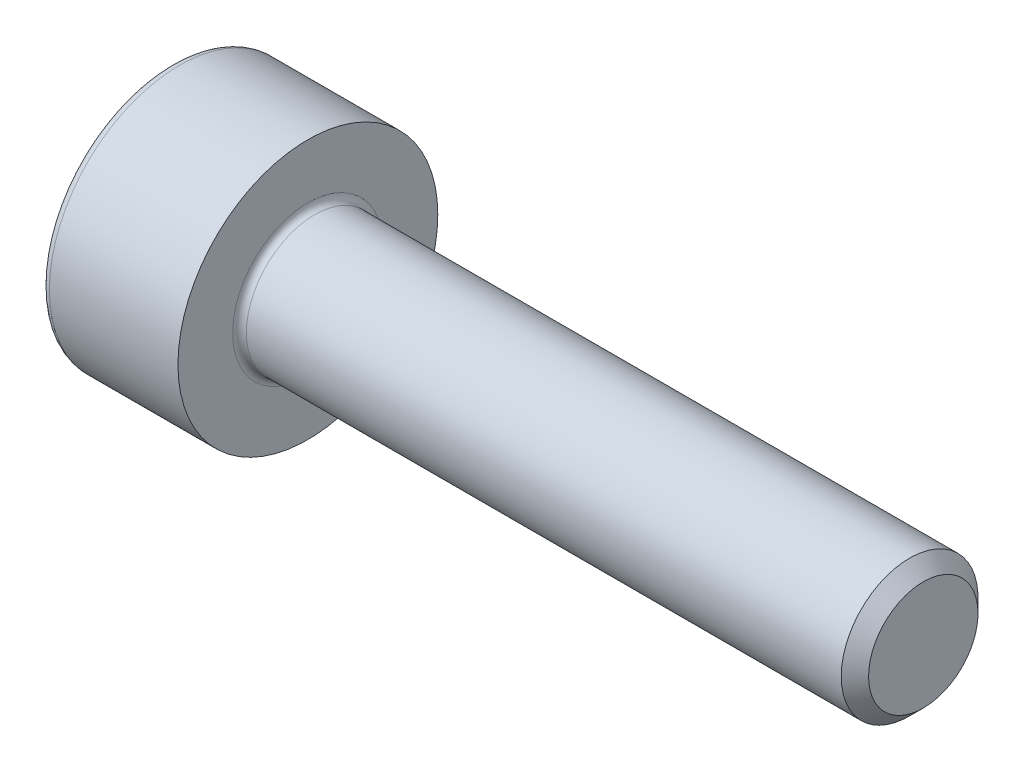
ISO-10303-21;
HEADER;
FILE_DESCRIPTION(('STEP AP214'),'2;1');
FILE_NAME('part.step','',(''),(''),'','','');
FILE_SCHEMA(('AUTOMOTIVE_DESIGN { 1 0 10303 214 1 1 1 1 }'));
ENDSEC;
DATA;
#1=APPLICATION_CONTEXT('core data for automotive mechanical design processes');
#2=APPLICATION_PROTOCOL_DEFINITION('international standard','automotive_design',2000,#1);
#3=PRODUCT_CONTEXT('',#1,'mechanical');
#4=PRODUCT('Part','Part','',(#3));
#5=PRODUCT_RELATED_PRODUCT_CATEGORY('part','',(#4));
#6=PRODUCT_DEFINITION_FORMATION('','',#4);
#7=PRODUCT_DEFINITION_CONTEXT('part definition',#1,'design');
#8=PRODUCT_DEFINITION('design','',#6,#7);
#9=PRODUCT_DEFINITION_SHAPE('','',#8);
#10=(LENGTH_UNIT() NAMED_UNIT(*) SI_UNIT(.MILLI.,.METRE.));
#11=(NAMED_UNIT(*) PLANE_ANGLE_UNIT() SI_UNIT($,.RADIAN.));
#12=(NAMED_UNIT(*) SI_UNIT($,.STERADIAN.) SOLID_ANGLE_UNIT());
#13=UNCERTAINTY_MEASURE_WITH_UNIT(LENGTH_MEASURE(1.E-05),#10,'distance_accuracy_value','');
#14=(GEOMETRIC_REPRESENTATION_CONTEXT(3) GLOBAL_UNCERTAINTY_ASSIGNED_CONTEXT((#13)) GLOBAL_UNIT_ASSIGNED_CONTEXT((#10,
#11,#12)) REPRESENTATION_CONTEXT('',''));
#15=CARTESIAN_POINT('',(0.,0.,0.));
#16=DIRECTION('',(0.,0.,1.));
#17=DIRECTION('',(1.,0.,0.));
#18=AXIS2_PLACEMENT_3D('',#15,#16,#17);
#19=CARTESIAN_POINT('',(11.0000000000048,0.,0.));
#20=DIRECTION('',(-1.,0.,0.));
#21=DIRECTION('',(0.,0.,1.));
#22=AXIS2_PLACEMENT_3D('',#19,#20,#21);
#23=PLANE('',#22);
#24=CARTESIAN_POINT('',(11.0000000000048,0.,0.));
#25=DIRECTION('',(-1.,0.,0.));
#26=DIRECTION('',(0.,0.,1.));
#27=AXIS2_PLACEMENT_3D('',#24,#25,#26);
#28=CIRCLE('',#27,0.800000000000007);
#29=CARTESIAN_POINT('',(11.0000000000048,0.,0.800000000000007));
#30=VERTEX_POINT('',#29);
#31=EDGE_CURVE('E11',#30,#30,#28,.F.);
#32=ORIENTED_EDGE('',*,*,#31,.T.);
#33=EDGE_LOOP('',(#32));
#34=FACE_BOUND('',#33,.T.);
#35=ADVANCED_FACE('F37',(#34),#23,.F.);
#36=CARTESIAN_POINT('',(0.,0.,0.));
#37=DIRECTION('',(-1.,0.,0.));
#38=DIRECTION('',(0.,0.,1.));
#39=AXIS2_PLACEMENT_3D('',#36,#37,#38);
#40=CYLINDRICAL_SURFACE('',#39,1.);
#41=CARTESIAN_POINT('',(10.8000000000048,0.,0.));
#42=DIRECTION('',(-1.,0.,0.));
#43=DIRECTION('',(0.,0.,1.));
#44=AXIS2_PLACEMENT_3D('',#41,#42,#43);
#45=CIRCLE('',#44,1.);
#46=CARTESIAN_POINT('',(10.8000000000048,0.,1.));
#47=VERTEX_POINT('',#46);
#48=EDGE_CURVE('E45',#47,#47,#45,.T.);
#49=ORIENTED_EDGE('',*,*,#48,.T.);
#50=EDGE_LOOP('',(#49));
#51=FACE_BOUND('',#50,.T.);
#52=CARTESIAN_POINT('',(2.10000000000477,0.,0.));
#53=DIRECTION('',(1.,0.,0.));
#54=DIRECTION('',(0.,0.,-1.));
#55=AXIS2_PLACEMENT_3D('',#52,#53,#54);
#56=CIRCLE('',#55,1.);
#57=CARTESIAN_POINT('',(2.10000000000477,0.,-1.));
#58=VERTEX_POINT('',#57);
#59=EDGE_CURVE('E150',#58,#58,#56,.T.);
#60=ORIENTED_EDGE('',*,*,#59,.T.);
#61=EDGE_LOOP('',(#60));
#62=FACE_BOUND('',#61,.T.);
#63=ADVANCED_FACE('F161',(#51,#62),#40,.T.);
#64=CARTESIAN_POINT('',(2.00000000000477,0.,0.));
#65=DIRECTION('',(1.,0.,0.));
#66=DIRECTION('',(0.,0.,-1.));
#67=AXIS2_PLACEMENT_3D('',#64,#65,#66);
#68=PLANE('',#67);
#69=CARTESIAN_POINT('',(2.00000000000477,0.,0.));
#70=DIRECTION('',(1.,0.,0.));
#71=DIRECTION('',(0.,0.,-1.));
#72=AXIS2_PLACEMENT_3D('',#69,#70,#71);
#73=CIRCLE('',#72,1.1);
#74=CARTESIAN_POINT('',(2.00000000000477,0.,-1.1));
#75=VERTEX_POINT('',#74);
#76=EDGE_CURVE('E147',#75,#75,#73,.F.);
#77=ORIENTED_EDGE('',*,*,#76,.T.);
#78=EDGE_LOOP('',(#77));
#79=FACE_BOUND('',#78,.T.);
#80=CARTESIAN_POINT('',(2.00000000000477,0.,0.));
#81=DIRECTION('',(-1.,0.,0.));
#82=DIRECTION('',(0.,0.,1.));
#83=AXIS2_PLACEMENT_3D('',#80,#81,#82);
#84=CIRCLE('',#83,1.9);
#85=CARTESIAN_POINT('',(2.00000000000477,0.,1.9));
#86=VERTEX_POINT('',#85);
#87=EDGE_CURVE('E139',#86,#86,#84,.T.);
#88=ORIENTED_EDGE('',*,*,#87,.F.);
#89=EDGE_LOOP('',(#88));
#90=FACE_BOUND('',#89,.T.);
#91=ADVANCED_FACE('F183',(#79,#90),#68,.T.);
#92=CARTESIAN_POINT('',(0.,0.,0.));
#93=DIRECTION('',(-1.,0.,0.));
#94=DIRECTION('',(0.,0.,1.));
#95=AXIS2_PLACEMENT_3D('',#92,#93,#94);
#96=CYLINDRICAL_SURFACE('',#95,1.9);
#97=CARTESIAN_POINT('',(0.12,0.,0.));
#98=DIRECTION('',(-1.,0.,0.));
#99=DIRECTION('',(0.,0.,1.));
#100=AXIS2_PLACEMENT_3D('',#97,#98,#99);
#101=CIRCLE('',#100,1.9);
#102=CARTESIAN_POINT('',(0.12,0.,1.9));
#103=VERTEX_POINT('',#102);
#104=EDGE_CURVE('E156',#103,#103,#101,.F.);
#105=ORIENTED_EDGE('',*,*,#104,.T.);
#106=EDGE_LOOP('',(#105));
#107=FACE_BOUND('',#106,.T.);
#108=ORIENTED_EDGE('',*,*,#87,.T.);
#109=EDGE_LOOP('',(#108));
#110=FACE_BOUND('',#109,.T.);
#111=ADVANCED_FACE('F193',(#107,#110),#96,.T.);
#112=CARTESIAN_POINT('',(0.,0.,0.));
#113=DIRECTION('',(-1.,0.,0.));
#114=DIRECTION('',(0.,0.,1.));
#115=AXIS2_PLACEMENT_3D('',#112,#113,#114);
#116=PLANE('',#115);
#117=DIRECTION('',(0.,0.5,-0.866025403784439));
#118=VECTOR('',#117,1.);
#119=CARTESIAN_POINT('',(0.,0.43301270189222,0.749999999999999));
#120=LINE('',#119,#118);
#121=CARTESIAN_POINT('',(0.,0.43301270189222,0.749999999999999));
#122=VERTEX_POINT('',#121);
#123=CARTESIAN_POINT('',(0.,0.866025403784438,0.));
#124=VERTEX_POINT('',#123);
#125=EDGE_CURVE('E52',#122,#124,#120,.T.);
#126=ORIENTED_EDGE('',*,*,#125,.F.);
#127=DIRECTION('',(0.,1.,0.));
#128=VECTOR('',#127,1.);
#129=CARTESIAN_POINT('',(0.,-0.43301270189222,0.749999999999999));
#130=LINE('',#129,#128);
#131=CARTESIAN_POINT('',(0.,-0.43301270189222,0.749999999999999));
#132=VERTEX_POINT('',#131);
#133=EDGE_CURVE('E135',#132,#122,#130,.T.);
#134=ORIENTED_EDGE('',*,*,#133,.F.);
#135=DIRECTION('',(0.,0.5,0.866025403784439));
#136=VECTOR('',#135,1.);
#137=CARTESIAN_POINT('',(0.,-0.866025403784438,0.));
#138=LINE('',#137,#136);
#139=CARTESIAN_POINT('',(0.,-0.866025403784438,0.));
#140=VERTEX_POINT('',#139);
#141=EDGE_CURVE('E133',#140,#132,#138,.T.);
#142=ORIENTED_EDGE('',*,*,#141,.F.);
#143=DIRECTION('',(0.,-0.5,0.866025403784439));
#144=VECTOR('',#143,1.);
#145=CARTESIAN_POINT('',(0.,-0.433012701892219,-0.75));
#146=LINE('',#145,#144);
#147=CARTESIAN_POINT('',(0.,-0.433012701892219,-0.75));
#148=VERTEX_POINT('',#147);
#149=EDGE_CURVE('E100',#148,#140,#146,.T.);
#150=ORIENTED_EDGE('',*,*,#149,.F.);
#151=DIRECTION('',(0.,-1.,0.));
#152=VECTOR('',#151,1.);
#153=CARTESIAN_POINT('',(0.,0.433012701892219,-0.75));
#154=LINE('',#153,#152);
#155=CARTESIAN_POINT('',(0.,0.433012701892219,-0.75));
#156=VERTEX_POINT('',#155);
#157=EDGE_CURVE('E129',#156,#148,#154,.T.);
#158=ORIENTED_EDGE('',*,*,#157,.F.);
#159=DIRECTION('',(0.,-0.5,-0.866025403784439));
#160=VECTOR('',#159,1.);
#161=CARTESIAN_POINT('',(0.,0.866025403784438,0.));
#162=LINE('',#161,#160);
#163=EDGE_CURVE('E126',#124,#156,#162,.T.);
#164=ORIENTED_EDGE('',*,*,#163,.F.);
#165=EDGE_LOOP('',(#126,#134,#142,#150,#158,#164));
#166=FACE_BOUND('',#165,.T.);
#167=CARTESIAN_POINT('',(0.,0.,0.));
#168=DIRECTION('',(-1.,0.,0.));
#169=DIRECTION('',(0.,0.,1.));
#170=AXIS2_PLACEMENT_3D('',#167,#168,#169);
#171=CIRCLE('',#170,1.78);
#172=CARTESIAN_POINT('',(0.,0.,1.78));
#173=VERTEX_POINT('',#172);
#174=EDGE_CURVE('E153',#173,#173,#171,.T.);
#175=ORIENTED_EDGE('',*,*,#174,.T.);
#176=EDGE_LOOP('',(#175));
#177=FACE_BOUND('',#176,.T.);
#178=ADVANCED_FACE('F188',(#166,#177),#116,.T.);
#179=CARTESIAN_POINT('',(2.10000000000477,0.,0.));
#180=DIRECTION('',(1.,0.,0.));
#181=DIRECTION('',(0.,0.,-1.));
#182=AXIS2_PLACEMENT_3D('',#179,#180,#181);
#183=TOROIDAL_SURFACE('',#182,1.1,0.1);
#184=ORIENTED_EDGE('',*,*,#59,.F.);
#185=EDGE_LOOP('',(#184));
#186=FACE_BOUND('',#185,.T.);
#187=ORIENTED_EDGE('',*,*,#76,.F.);
#188=EDGE_LOOP('',(#187));
#189=FACE_BOUND('',#188,.T.);
#190=ADVANCED_FACE('F174',(#186,#189),#183,.F.);
#191=CARTESIAN_POINT('',(0.12,0.,0.));
#192=DIRECTION('',(-1.,0.,0.));
#193=DIRECTION('',(0.,0.,1.));
#194=AXIS2_PLACEMENT_3D('',#191,#192,#193);
#195=TOROIDAL_SURFACE('',#194,1.78,0.12);
#196=ORIENTED_EDGE('',*,*,#104,.F.);
#197=EDGE_LOOP('',(#196));
#198=FACE_BOUND('',#197,.T.);
#199=ORIENTED_EDGE('',*,*,#174,.F.);
#200=EDGE_LOOP('',(#199));
#201=FACE_BOUND('',#200,.T.);
#202=ADVANCED_FACE('F166',(#198,#201),#195,.T.);
#203=CARTESIAN_POINT('',(10.8000000000048,0.,0.));
#204=DIRECTION('',(-1.,0.,0.));
#205=DIRECTION('',(0.,0.,1.));
#206=AXIS2_PLACEMENT_3D('',#203,#204,#205);
#207=CONICAL_SURFACE('',#206,1.,0.785398163397444);
#208=ORIENTED_EDGE('',*,*,#31,.F.);
#209=EDGE_LOOP('',(#208));
#210=FACE_BOUND('',#209,.T.);
#211=ORIENTED_EDGE('',*,*,#48,.F.);
#212=EDGE_LOOP('',(#211));
#213=FACE_BOUND('',#212,.T.);
#214=ADVANCED_FACE('F39',(#210,#213),#207,.T.);
#215=CARTESIAN_POINT('',(1.,0.43301270189222,0.749999999999999));
#216=DIRECTION('',(0.,0.866025403784439,0.5));
#217=DIRECTION('',(0.,-0.5,0.866025403784439));
#218=AXIS2_PLACEMENT_3D('',#215,#216,#217);
#219=PLANE('',#218);
#220=ORIENTED_EDGE('',*,*,#125,.T.);
#221=DIRECTION('',(-1.,0.,0.));
#222=VECTOR('',#221,1.);
#223=CARTESIAN_POINT('',(1.,0.866025403784438,0.));
#224=LINE('',#223,#222);
#225=CARTESIAN_POINT('',(1.,0.866025403784438,0.));
#226=VERTEX_POINT('',#225);
#227=EDGE_CURVE('E82',#226,#124,#224,.T.);
#228=ORIENTED_EDGE('',*,*,#227,.F.);
#229=DIRECTION('',(0.,0.5,-0.866025403784439));
#230=VECTOR('',#229,1.);
#231=CARTESIAN_POINT('',(1.,0.43301270189222,0.749999999999999));
#232=LINE('',#231,#230);
#233=CARTESIAN_POINT('',(1.,0.43301270189222,0.749999999999999));
#234=VERTEX_POINT('',#233);
#235=EDGE_CURVE('E137',#234,#226,#232,.T.);
#236=ORIENTED_EDGE('',*,*,#235,.F.);
#237=DIRECTION('',(-1.,0.,0.));
#238=VECTOR('',#237,1.);
#239=CARTESIAN_POINT('',(1.,0.43301270189222,0.749999999999999));
#240=LINE('',#239,#238);
#241=EDGE_CURVE('E60',#234,#122,#240,.T.);
#242=ORIENTED_EDGE('',*,*,#241,.T.);
#243=EDGE_LOOP('',(#220,#228,#236,#242));
#244=FACE_BOUND('',#243,.T.);
#245=ADVANCED_FACE('F165',(#244),#219,.F.);
#246=CARTESIAN_POINT('',(1.,-0.43301270189222,0.749999999999999));
#247=DIRECTION('',(0.,0.,1.));
#248=DIRECTION('',(0.,-1.,0.));
#249=AXIS2_PLACEMENT_3D('',#246,#247,#248);
#250=PLANE('',#249);
#251=ORIENTED_EDGE('',*,*,#133,.T.);
#252=ORIENTED_EDGE('',*,*,#241,.F.);
#253=DIRECTION('',(0.,1.,0.));
#254=VECTOR('',#253,1.);
#255=CARTESIAN_POINT('',(1.,-0.43301270189222,0.749999999999999));
#256=LINE('',#255,#254);
#257=CARTESIAN_POINT('',(1.,-0.43301270189222,0.749999999999999));
#258=VERTEX_POINT('',#257);
#259=EDGE_CURVE('E112',#258,#234,#256,.T.);
#260=ORIENTED_EDGE('',*,*,#259,.F.);
#261=DIRECTION('',(-1.,0.,0.));
#262=VECTOR('',#261,1.);
#263=CARTESIAN_POINT('',(1.,-0.43301270189222,0.749999999999999));
#264=LINE('',#263,#262);
#265=EDGE_CURVE('E104',#258,#132,#264,.T.);
#266=ORIENTED_EDGE('',*,*,#265,.T.);
#267=EDGE_LOOP('',(#251,#252,#260,#266));
#268=FACE_BOUND('',#267,.T.);
#269=ADVANCED_FACE('F172',(#268),#250,.F.);
#270=CARTESIAN_POINT('',(1.,-0.866025403784438,0.));
#271=DIRECTION('',(0.,-0.866025403784439,0.5));
#272=DIRECTION('',(0.,-0.5,-0.866025403784439));
#273=AXIS2_PLACEMENT_3D('',#270,#271,#272);
#274=PLANE('',#273);
#275=ORIENTED_EDGE('',*,*,#141,.T.);
#276=ORIENTED_EDGE('',*,*,#265,.F.);
#277=DIRECTION('',(0.,0.5,0.866025403784439));
#278=VECTOR('',#277,1.);
#279=CARTESIAN_POINT('',(1.,-0.866025403784438,0.));
#280=LINE('',#279,#278);
#281=CARTESIAN_POINT('',(1.,-0.866025403784438,0.));
#282=VERTEX_POINT('',#281);
#283=EDGE_CURVE('E108',#282,#258,#280,.T.);
#284=ORIENTED_EDGE('',*,*,#283,.F.);
#285=DIRECTION('',(-1.,0.,0.));
#286=VECTOR('',#285,1.);
#287=CARTESIAN_POINT('',(1.,-0.866025403784438,0.));
#288=LINE('',#287,#286);
#289=EDGE_CURVE('E93',#282,#140,#288,.T.);
#290=ORIENTED_EDGE('',*,*,#289,.T.);
#291=EDGE_LOOP('',(#275,#276,#284,#290));
#292=FACE_BOUND('',#291,.T.);
#293=ADVANCED_FACE('F109',(#292),#274,.F.);
#294=CARTESIAN_POINT('',(1.,-0.433012701892219,-0.75));
#295=DIRECTION('',(0.,-0.866025403784439,-0.5));
#296=DIRECTION('',(0.,0.5,-0.866025403784439));
#297=AXIS2_PLACEMENT_3D('',#294,#295,#296);
#298=PLANE('',#297);
#299=ORIENTED_EDGE('',*,*,#149,.T.);
#300=ORIENTED_EDGE('',*,*,#289,.F.);
#301=DIRECTION('',(0.,-0.5,0.866025403784439));
#302=VECTOR('',#301,1.);
#303=CARTESIAN_POINT('',(1.,-0.433012701892219,-0.75));
#304=LINE('',#303,#302);
#305=CARTESIAN_POINT('',(1.,-0.433012701892219,-0.75));
#306=VERTEX_POINT('',#305);
#307=EDGE_CURVE('E97',#306,#282,#304,.T.);
#308=ORIENTED_EDGE('',*,*,#307,.F.);
#309=DIRECTION('',(-1.,0.,0.));
#310=VECTOR('',#309,1.);
#311=CARTESIAN_POINT('',(1.,-0.433012701892219,-0.75));
#312=LINE('',#311,#310);
#313=EDGE_CURVE('E105',#306,#148,#312,.T.);
#314=ORIENTED_EDGE('',*,*,#313,.T.);
#315=EDGE_LOOP('',(#299,#300,#308,#314));
#316=FACE_BOUND('',#315,.T.);
#317=ADVANCED_FACE('F95',(#316),#298,.F.);
#318=CARTESIAN_POINT('',(1.,0.433012701892219,-0.75));
#319=DIRECTION('',(0.,0.,-1.));
#320=DIRECTION('',(0.,1.,0.));
#321=AXIS2_PLACEMENT_3D('',#318,#319,#320);
#322=PLANE('',#321);
#323=ORIENTED_EDGE('',*,*,#157,.T.);
#324=ORIENTED_EDGE('',*,*,#313,.F.);
#325=DIRECTION('',(0.,-1.,0.));
#326=VECTOR('',#325,1.);
#327=CARTESIAN_POINT('',(1.,0.433012701892219,-0.75));
#328=LINE('',#327,#326);
#329=CARTESIAN_POINT('',(1.,0.433012701892219,-0.75));
#330=VERTEX_POINT('',#329);
#331=EDGE_CURVE('E118',#330,#306,#328,.T.);
#332=ORIENTED_EDGE('',*,*,#331,.F.);
#333=DIRECTION('',(-1.,0.,0.));
#334=VECTOR('',#333,1.);
#335=CARTESIAN_POINT('',(1.,0.433012701892219,-0.75));
#336=LINE('',#335,#334);
#337=EDGE_CURVE('E142',#330,#156,#336,.T.);
#338=ORIENTED_EDGE('',*,*,#337,.T.);
#339=EDGE_LOOP('',(#323,#324,#332,#338));
#340=FACE_BOUND('',#339,.T.);
#341=ADVANCED_FACE('F213',(#340),#322,.F.);
#342=CARTESIAN_POINT('',(1.,0.866025403784438,0.));
#343=DIRECTION('',(0.,0.866025403784439,-0.5));
#344=DIRECTION('',(0.,0.5,0.866025403784439));
#345=AXIS2_PLACEMENT_3D('',#342,#343,#344);
#346=PLANE('',#345);
#347=ORIENTED_EDGE('',*,*,#163,.T.);
#348=ORIENTED_EDGE('',*,*,#337,.F.);
#349=DIRECTION('',(0.,-0.5,-0.866025403784439));
#350=VECTOR('',#349,1.);
#351=CARTESIAN_POINT('',(1.,0.866025403784438,0.));
#352=LINE('',#351,#350);
#353=EDGE_CURVE('E120',#226,#330,#352,.T.);
#354=ORIENTED_EDGE('',*,*,#353,.F.);
#355=ORIENTED_EDGE('',*,*,#227,.T.);
#356=EDGE_LOOP('',(#347,#348,#354,#355));
#357=FACE_BOUND('',#356,.T.);
#358=ADVANCED_FACE('F210',(#357),#346,.F.);
#359=CARTESIAN_POINT('',(1.,0.,0.));
#360=DIRECTION('',(-1.,0.,0.));
#361=DIRECTION('',(0.,0.,1.));
#362=AXIS2_PLACEMENT_3D('',#359,#360,#361);
#363=PLANE('',#362);
#364=ORIENTED_EDGE('',*,*,#235,.T.);
#365=ORIENTED_EDGE('',*,*,#353,.T.);
#366=ORIENTED_EDGE('',*,*,#331,.T.);
#367=ORIENTED_EDGE('',*,*,#307,.T.);
#368=ORIENTED_EDGE('',*,*,#283,.T.);
#369=ORIENTED_EDGE('',*,*,#259,.T.);
#370=EDGE_LOOP('',(#364,#365,#366,#367,#368,#369));
#371=FACE_BOUND('',#370,.T.);
#372=ADVANCED_FACE('F115',(#371),#363,.T.);
#373=CLOSED_SHELL('',(#35,#63,#91,#111,#178,#190,#202,#214,#245,#269,#293,#317,#341,#358,#372));
#374=MANIFOLD_SOLID_BREP('B2',#373);
#375=ADVANCED_BREP_SHAPE_REPRESENTATION('',(#18,#374),#14);
#376=SHAPE_DEFINITION_REPRESENTATION(#9,#375);
ENDSEC;
END-ISO-10303-21;
